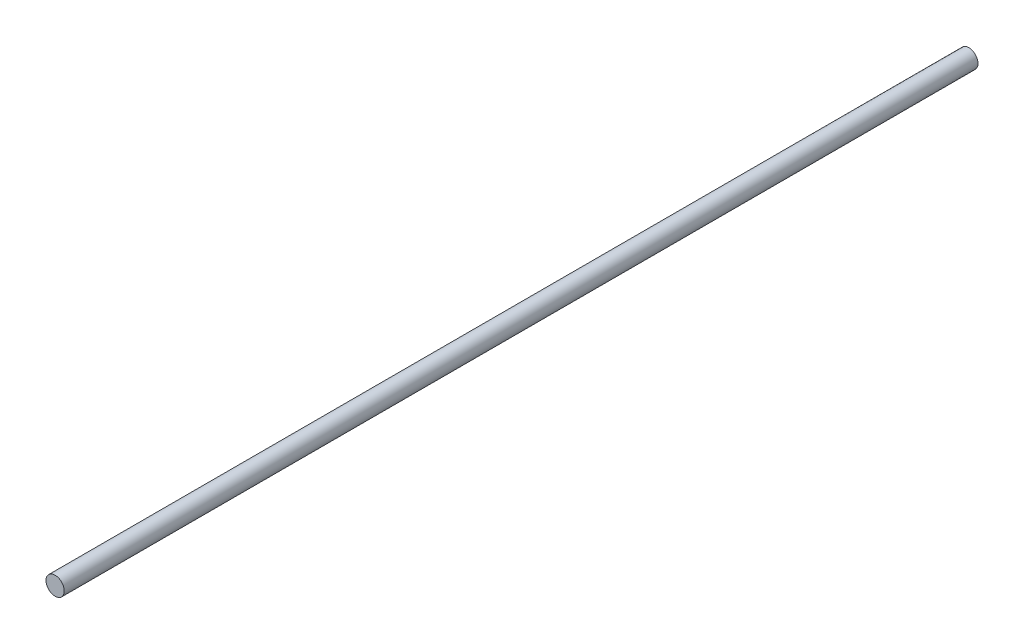
ISO-10303-21;
HEADER;
FILE_DESCRIPTION(('STEP AP214'),'2;1');
FILE_NAME('part.step','',(''),(''),'','','');
FILE_SCHEMA(('AUTOMOTIVE_DESIGN { 1 0 10303 214 1 1 1 1 }'));
ENDSEC;
DATA;
#1=APPLICATION_CONTEXT('core data for automotive mechanical design processes');
#2=APPLICATION_PROTOCOL_DEFINITION('international standard','automotive_design',2000,#1);
#3=PRODUCT_CONTEXT('',#1,'mechanical');
#4=PRODUCT('Part','Part','',(#3));
#5=PRODUCT_RELATED_PRODUCT_CATEGORY('part','',(#4));
#6=PRODUCT_DEFINITION_FORMATION('','',#4);
#7=PRODUCT_DEFINITION_CONTEXT('part definition',#1,'design');
#8=PRODUCT_DEFINITION('design','',#6,#7);
#9=PRODUCT_DEFINITION_SHAPE('','',#8);
#10=(LENGTH_UNIT() NAMED_UNIT(*) SI_UNIT(.MILLI.,.METRE.));
#11=(NAMED_UNIT(*) PLANE_ANGLE_UNIT() SI_UNIT($,.RADIAN.));
#12=(NAMED_UNIT(*) SI_UNIT($,.STERADIAN.) SOLID_ANGLE_UNIT());
#13=UNCERTAINTY_MEASURE_WITH_UNIT(LENGTH_MEASURE(1.E-05),#10,'distance_accuracy_value','');
#14=(GEOMETRIC_REPRESENTATION_CONTEXT(3) GLOBAL_UNCERTAINTY_ASSIGNED_CONTEXT((#13)) GLOBAL_UNIT_ASSIGNED_CONTEXT((#10,
#11,#12)) REPRESENTATION_CONTEXT('',''));
#15=CARTESIAN_POINT('',(0.,0.,0.));
#16=DIRECTION('',(0.,0.,1.));
#17=DIRECTION('',(1.,0.,0.));
#18=AXIS2_PLACEMENT_3D('',#15,#16,#17);
#19=CARTESIAN_POINT('',(0.,0.,400.));
#20=DIRECTION('',(0.,0.,-1.));
#21=DIRECTION('',(-1.,0.,0.));
#22=AXIS2_PLACEMENT_3D('',#19,#20,#21);
#23=CYLINDRICAL_SURFACE('',#22,4.);
#24=CARTESIAN_POINT('',(0.,0.,400.));
#25=DIRECTION('',(0.,0.,1.));
#26=DIRECTION('',(1.,0.,0.));
#27=AXIS2_PLACEMENT_3D('',#24,#25,#26);
#28=CIRCLE('',#27,4.);
#29=CARTESIAN_POINT('',(4.,0.,400.));
#30=VERTEX_POINT('',#29);
#31=EDGE_CURVE('E10',#30,#30,#28,.T.);
#32=ORIENTED_EDGE('',*,*,#31,.F.);
#33=EDGE_LOOP('',(#32));
#34=FACE_BOUND('',#33,.T.);
#35=CARTESIAN_POINT('',(0.,0.,0.));
#36=DIRECTION('',(0.,0.,1.));
#37=DIRECTION('',(1.,0.,0.));
#38=AXIS2_PLACEMENT_3D('',#35,#36,#37);
#39=CIRCLE('',#38,4.);
#40=CARTESIAN_POINT('',(4.,0.,0.));
#41=VERTEX_POINT('',#40);
#42=EDGE_CURVE('E38',#41,#41,#39,.T.);
#43=ORIENTED_EDGE('',*,*,#42,.T.);
#44=EDGE_LOOP('',(#43));
#45=FACE_BOUND('',#44,.T.);
#46=ADVANCED_FACE('F35',(#34,#45),#23,.T.);
#47=CARTESIAN_POINT('',(0.,0.,400.));
#48=DIRECTION('',(0.,0.,1.));
#49=DIRECTION('',(1.,0.,0.));
#50=AXIS2_PLACEMENT_3D('',#47,#48,#49);
#51=PLANE('',#50);
#52=ORIENTED_EDGE('',*,*,#31,.T.);
#53=EDGE_LOOP('',(#52));
#54=FACE_BOUND('',#53,.T.);
#55=ADVANCED_FACE('F50',(#54),#51,.T.);
#56=CARTESIAN_POINT('',(0.,0.,0.));
#57=DIRECTION('',(0.,0.,1.));
#58=DIRECTION('',(1.,0.,0.));
#59=AXIS2_PLACEMENT_3D('',#56,#57,#58);
#60=PLANE('',#59);
#61=ORIENTED_EDGE('',*,*,#42,.F.);
#62=EDGE_LOOP('',(#61));
#63=FACE_BOUND('',#62,.T.);
#64=ADVANCED_FACE('F48',(#63),#60,.F.);
#65=CLOSED_SHELL('',(#46,#55,#64));
#66=MANIFOLD_SOLID_BREP('B2',#65);
#67=ADVANCED_BREP_SHAPE_REPRESENTATION('',(#18,#66),#14);
#68=SHAPE_DEFINITION_REPRESENTATION(#9,#67);
ENDSEC;
END-ISO-10303-21;
